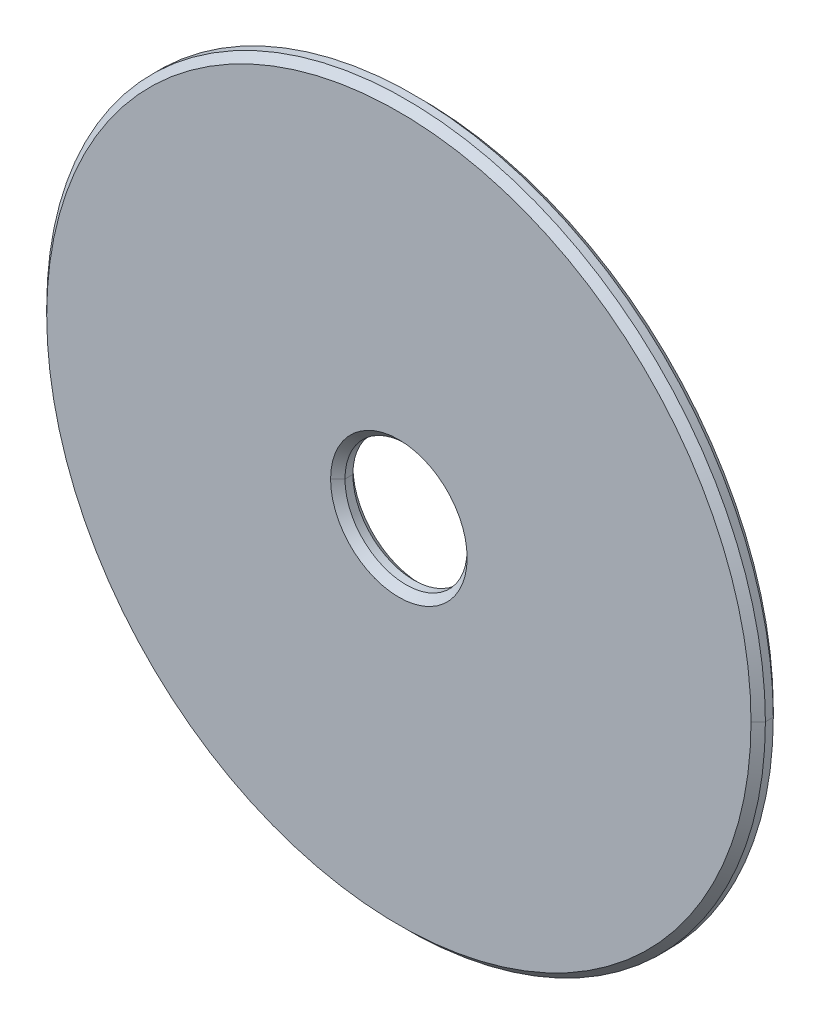
ISO-10303-21;
HEADER;
FILE_DESCRIPTION(('STEP AP214'),'2;1');
FILE_NAME('part.step','',(''),(''),'','','');
FILE_SCHEMA(('AUTOMOTIVE_DESIGN { 1 0 10303 214 1 1 1 1 }'));
ENDSEC;
DATA;
#1=APPLICATION_CONTEXT('core data for automotive mechanical design processes');
#2=APPLICATION_PROTOCOL_DEFINITION('international standard','automotive_design',2000,#1);
#3=PRODUCT_CONTEXT('',#1,'mechanical');
#4=PRODUCT('Part','Part','',(#3));
#5=PRODUCT_RELATED_PRODUCT_CATEGORY('part','',(#4));
#6=PRODUCT_DEFINITION_FORMATION('','',#4);
#7=PRODUCT_DEFINITION_CONTEXT('part definition',#1,'design');
#8=PRODUCT_DEFINITION('design','',#6,#7);
#9=PRODUCT_DEFINITION_SHAPE('','',#8);
#10=(LENGTH_UNIT() NAMED_UNIT(*) SI_UNIT(.MILLI.,.METRE.));
#11=(NAMED_UNIT(*) PLANE_ANGLE_UNIT() SI_UNIT($,.RADIAN.));
#12=(NAMED_UNIT(*) SI_UNIT($,.STERADIAN.) SOLID_ANGLE_UNIT());
#13=UNCERTAINTY_MEASURE_WITH_UNIT(LENGTH_MEASURE(1.E-05),#10,'distance_accuracy_value','');
#14=(GEOMETRIC_REPRESENTATION_CONTEXT(3) GLOBAL_UNCERTAINTY_ASSIGNED_CONTEXT((#13)) GLOBAL_UNIT_ASSIGNED_CONTEXT((#10,
#11,#12)) REPRESENTATION_CONTEXT('',''));
#15=CARTESIAN_POINT('',(0.,0.,0.));
#16=DIRECTION('',(0.,0.,1.));
#17=DIRECTION('',(1.,0.,0.));
#18=AXIS2_PLACEMENT_3D('',#15,#16,#17);
#19=CARTESIAN_POINT('',(0.,0.,0.284487321940548));
#20=DIRECTION('',(0.,0.,-1.));
#21=DIRECTION('',(-1.,0.,0.));
#22=AXIS2_PLACEMENT_3D('',#19,#20,#21);
#23=CONICAL_SURFACE('',#22,2.12851267805944,0.785398163397455);
#24=CARTESIAN_POINT('',(0.,0.,0.253999999999991));
#25=DIRECTION('',(0.,0.,1.));
#26=DIRECTION('',(1.,0.,0.));
#27=AXIS2_PLACEMENT_3D('',#24,#25,#26);
#28=CIRCLE('',#27,2.159);
#29=CARTESIAN_POINT('',(2.159,0.,0.253999999999993));
#30=VERTEX_POINT('',#29);
#31=CARTESIAN_POINT('',(-2.159,0.,0.253999999999993));
#32=VERTEX_POINT('',#31);
#33=EDGE_CURVE('E20',#30,#32,#28,.T.);
#34=ORIENTED_EDGE('',*,*,#33,.T.);
#35=DIRECTION('',(0.707106781186552,0.,0.707106781186543));
#36=VECTOR('',#35,1.);
#37=CARTESIAN_POINT('',(-2.413,0.,0.));
#38=LINE('',#37,#36);
#39=CARTESIAN_POINT('',(-2.413,0.,0.));
#40=VERTEX_POINT('',#39);
#41=EDGE_CURVE('E34',#40,#32,#38,.T.);
#42=ORIENTED_EDGE('',*,*,#41,.F.);
#43=CARTESIAN_POINT('',(0.,0.,0.));
#44=DIRECTION('',(0.,0.,1.));
#45=DIRECTION('',(1.,0.,0.));
#46=AXIS2_PLACEMENT_3D('',#43,#44,#45);
#47=CIRCLE('',#46,2.413);
#48=CARTESIAN_POINT('',(2.413,0.,0.));
#49=VERTEX_POINT('',#48);
#50=EDGE_CURVE('E39',#49,#40,#47,.T.);
#51=ORIENTED_EDGE('',*,*,#50,.F.);
#52=DIRECTION('',(-0.707106781186552,0.,0.707106781186543));
#53=VECTOR('',#52,1.);
#54=CARTESIAN_POINT('',(2.413,0.,0.));
#55=LINE('',#54,#53);
#56=EDGE_CURVE('E152',#49,#30,#55,.T.);
#57=ORIENTED_EDGE('',*,*,#56,.T.);
#58=EDGE_LOOP('',(#34,#42,#51,#57));
#59=FACE_BOUND('',#58,.T.);
#60=ADVANCED_FACE('F17',(#59),#23,.F.);
#61=CARTESIAN_POINT('',(0.,0.,0.502912678059445));
#62=DIRECTION('',(0.,0.,1.));
#63=DIRECTION('',(1.,0.,0.));
#64=AXIS2_PLACEMENT_3D('',#61,#62,#63);
#65=CONICAL_SURFACE('',#64,2.12851267805944,0.785398163397456);
#66=DIRECTION('',(0.707106781186553,0.,-0.707106781186542));
#67=VECTOR('',#66,1.);
#68=CARTESIAN_POINT('',(-2.413,0.,0.787399999999998));
#69=LINE('',#68,#67);
#70=CARTESIAN_POINT('',(-2.413,0.,0.787399999999999));
#71=VERTEX_POINT('',#70);
#72=CARTESIAN_POINT('',(-2.159,0.,0.5334));
#73=VERTEX_POINT('',#72);
#74=EDGE_CURVE('E26',#71,#73,#69,.T.);
#75=ORIENTED_EDGE('',*,*,#74,.F.);
#76=CARTESIAN_POINT('',(0.,0.,0.787399999999997));
#77=DIRECTION('',(0.,0.,-1.));
#78=DIRECTION('',(1.,0.,0.));
#79=AXIS2_PLACEMENT_3D('',#76,#77,#78);
#80=CIRCLE('',#79,2.413);
#81=CARTESIAN_POINT('',(2.413,0.,0.787399999999999));
#82=VERTEX_POINT('',#81);
#83=EDGE_CURVE('E81',#82,#71,#80,.T.);
#84=ORIENTED_EDGE('',*,*,#83,.F.);
#85=DIRECTION('',(-0.707106781186553,0.,-0.707106781186542));
#86=VECTOR('',#85,1.);
#87=CARTESIAN_POINT('',(2.413,0.,0.787399999999998));
#88=LINE('',#87,#86);
#89=CARTESIAN_POINT('',(2.159,0.,0.5334));
#90=VERTEX_POINT('',#89);
#91=EDGE_CURVE('E11',#82,#90,#88,.T.);
#92=ORIENTED_EDGE('',*,*,#91,.T.);
#93=CARTESIAN_POINT('',(0.,0.,0.533400000000003));
#94=DIRECTION('',(0.,0.,-1.));
#95=DIRECTION('',(1.,0.,0.));
#96=AXIS2_PLACEMENT_3D('',#93,#94,#95);
#97=CIRCLE('',#96,2.159);
#98=EDGE_CURVE('E157',#90,#73,#97,.T.);
#99=ORIENTED_EDGE('',*,*,#98,.T.);
#100=EDGE_LOOP('',(#75,#84,#92,#99));
#101=FACE_BOUND('',#100,.T.);
#102=ADVANCED_FACE('F83',(#101),#65,.F.);
#103=CARTESIAN_POINT('',(0.,0.,0.502912678059445));
#104=DIRECTION('',(0.,0.,1.));
#105=DIRECTION('',(1.,0.,0.));
#106=AXIS2_PLACEMENT_3D('',#103,#104,#105);
#107=CONICAL_SURFACE('',#106,2.12851267805944,0.785398163397456);
#108=CARTESIAN_POINT('',(0.,0.,0.533400000000003));
#109=DIRECTION('',(0.,0.,-1.));
#110=DIRECTION('',(-1.,0.,0.));
#111=AXIS2_PLACEMENT_3D('',#108,#109,#110);
#112=CIRCLE('',#111,2.159);
#113=EDGE_CURVE('E96',#73,#90,#112,.T.);
#114=ORIENTED_EDGE('',*,*,#113,.T.);
#115=ORIENTED_EDGE('',*,*,#91,.F.);
#116=CARTESIAN_POINT('',(0.,0.,0.787399999999997));
#117=DIRECTION('',(0.,0.,-1.));
#118=DIRECTION('',(-1.,0.,0.));
#119=AXIS2_PLACEMENT_3D('',#116,#117,#118);
#120=CIRCLE('',#119,2.413);
#121=EDGE_CURVE('E90',#71,#82,#120,.T.);
#122=ORIENTED_EDGE('',*,*,#121,.F.);
#123=ORIENTED_EDGE('',*,*,#74,.T.);
#124=EDGE_LOOP('',(#114,#115,#122,#123));
#125=FACE_BOUND('',#124,.T.);
#126=ADVANCED_FACE('F94',(#125),#107,.F.);
#127=CARTESIAN_POINT('',(0.,0.,3.175));
#128=DIRECTION('',(0.,0.,1.));
#129=DIRECTION('',(1.,0.,0.));
#130=AXIS2_PLACEMENT_3D('',#127,#128,#129);
#131=CYLINDRICAL_SURFACE('',#130,2.159);
#132=ORIENTED_EDGE('',*,*,#33,.F.);
#133=DIRECTION('',(0.,0.,-1.));
#134=VECTOR('',#133,1.);
#135=CARTESIAN_POINT('',(2.159,0.,0.533399999999999));
#136=LINE('',#135,#134);
#137=EDGE_CURVE('E153',#90,#30,#136,.T.);
#138=ORIENTED_EDGE('',*,*,#137,.F.);
#139=ORIENTED_EDGE('',*,*,#113,.F.);
#140=DIRECTION('',(0.,0.,-1.));
#141=VECTOR('',#140,1.);
#142=CARTESIAN_POINT('',(-2.159,0.,0.533399999999999));
#143=LINE('',#142,#141);
#144=EDGE_CURVE('E158',#73,#32,#143,.T.);
#145=ORIENTED_EDGE('',*,*,#144,.T.);
#146=EDGE_LOOP('',(#132,#138,#139,#145));
#147=FACE_BOUND('',#146,.T.);
#148=ADVANCED_FACE('F172',(#147),#131,.F.);
#149=CARTESIAN_POINT('',(0.,0.,3.175));
#150=DIRECTION('',(0.,0.,1.));
#151=DIRECTION('',(1.,0.,0.));
#152=AXIS2_PLACEMENT_3D('',#149,#150,#151);
#153=CYLINDRICAL_SURFACE('',#152,2.159);
#154=ORIENTED_EDGE('',*,*,#144,.F.);
#155=ORIENTED_EDGE('',*,*,#98,.F.);
#156=ORIENTED_EDGE('',*,*,#137,.T.);
#157=CARTESIAN_POINT('',(0.,0.,0.253999999999991));
#158=DIRECTION('',(0.,0.,1.));
#159=DIRECTION('',(-1.,0.,0.));
#160=AXIS2_PLACEMENT_3D('',#157,#158,#159);
#161=CIRCLE('',#160,2.159);
#162=EDGE_CURVE('E146',#32,#30,#161,.T.);
#163=ORIENTED_EDGE('',*,*,#162,.F.);
#164=EDGE_LOOP('',(#154,#155,#156,#163));
#165=FACE_BOUND('',#164,.T.);
#166=ADVANCED_FACE('F178',(#165),#153,.F.);
#167=CARTESIAN_POINT('',(0.,0.,0.284487321940548));
#168=DIRECTION('',(0.,0.,-1.));
#169=DIRECTION('',(-1.,0.,0.));
#170=AXIS2_PLACEMENT_3D('',#167,#168,#169);
#171=CONICAL_SURFACE('',#170,2.12851267805944,0.785398163397455);
#172=ORIENTED_EDGE('',*,*,#56,.F.);
#173=CARTESIAN_POINT('',(0.,0.,0.));
#174=DIRECTION('',(0.,0.,1.));
#175=DIRECTION('',(-1.,0.,0.));
#176=AXIS2_PLACEMENT_3D('',#173,#174,#175);
#177=CIRCLE('',#176,2.413);
#178=EDGE_CURVE('E140',#40,#49,#177,.T.);
#179=ORIENTED_EDGE('',*,*,#178,.F.);
#180=ORIENTED_EDGE('',*,*,#41,.T.);
#181=ORIENTED_EDGE('',*,*,#162,.T.);
#182=EDGE_LOOP('',(#172,#179,#180,#181));
#183=FACE_BOUND('',#182,.T.);
#184=ADVANCED_FACE('F179',(#183),#171,.F.);
#185=CARTESIAN_POINT('',(0.,0.,0.));
#186=DIRECTION('',(0.,0.,1.));
#187=DIRECTION('',(1.,0.,0.));
#188=AXIS2_PLACEMENT_3D('',#185,#186,#187);
#189=PLANE('',#188);
#190=ORIENTED_EDGE('',*,*,#50,.T.);
#191=ORIENTED_EDGE('',*,*,#178,.T.);
#192=EDGE_LOOP('',(#190,#191));
#193=FACE_BOUND('',#192,.T.);
#194=CARTESIAN_POINT('',(0.,0.,0.));
#195=DIRECTION('',(0.,0.,-1.));
#196=DIRECTION('',(-1.,0.,0.));
#197=AXIS2_PLACEMENT_3D('',#194,#195,#196);
#198=CIRCLE('',#197,12.446);
#199=CARTESIAN_POINT('',(-12.446,0.,0.));
#200=VERTEX_POINT('',#199);
#201=CARTESIAN_POINT('',(12.446,0.,0.));
#202=VERTEX_POINT('',#201);
#203=EDGE_CURVE('E137',#200,#202,#198,.T.);
#204=ORIENTED_EDGE('',*,*,#203,.T.);
#205=CARTESIAN_POINT('',(0.,0.,0.));
#206=DIRECTION('',(0.,0.,-1.));
#207=DIRECTION('',(1.,0.,0.));
#208=AXIS2_PLACEMENT_3D('',#205,#206,#207);
#209=CIRCLE('',#208,12.446);
#210=EDGE_CURVE('E131',#202,#200,#209,.T.);
#211=ORIENTED_EDGE('',*,*,#210,.T.);
#212=EDGE_LOOP('',(#204,#211));
#213=FACE_BOUND('',#212,.T.);
#214=ADVANCED_FACE('F181',(#193,#213),#189,.F.);
#215=CARTESIAN_POINT('',(0.,0.,-0.0304873219405723));
#216=DIRECTION('',(0.,0.,1.));
#217=DIRECTION('',(1.,0.,0.));
#218=AXIS2_PLACEMENT_3D('',#215,#216,#217);
#219=CONICAL_SURFACE('',#218,12.4155126780594,0.785398163397452);
#220=DIRECTION('',(0.70710678118655,0.,-0.707106781186545));
#221=VECTOR('',#220,1.);
#222=CARTESIAN_POINT('',(-12.7,0.,0.253999999999996));
#223=LINE('',#222,#221);
#224=CARTESIAN_POINT('',(-12.7,0.,0.253999999999996));
#225=VERTEX_POINT('',#224);
#226=EDGE_CURVE('E120',#225,#200,#223,.T.);
#227=ORIENTED_EDGE('',*,*,#226,.F.);
#228=CARTESIAN_POINT('',(0.,0.,0.253999999999999));
#229=DIRECTION('',(0.,0.,-1.));
#230=DIRECTION('',(-1.,0.,0.));
#231=AXIS2_PLACEMENT_3D('',#228,#229,#230);
#232=CIRCLE('',#231,12.7);
#233=CARTESIAN_POINT('',(12.7,0.,0.253999999999996));
#234=VERTEX_POINT('',#233);
#235=EDGE_CURVE('E119',#225,#234,#232,.T.);
#236=ORIENTED_EDGE('',*,*,#235,.T.);
#237=DIRECTION('',(-0.70710678118655,0.,-0.707106781186545));
#238=VECTOR('',#237,1.);
#239=CARTESIAN_POINT('',(12.7,0.,0.253999999999996));
#240=LINE('',#239,#238);
#241=EDGE_CURVE('E124',#234,#202,#240,.T.);
#242=ORIENTED_EDGE('',*,*,#241,.T.);
#243=ORIENTED_EDGE('',*,*,#203,.F.);
#244=EDGE_LOOP('',(#227,#236,#242,#243));
#245=FACE_BOUND('',#244,.T.);
#246=ADVANCED_FACE('F184',(#245),#219,.T.);
#247=CARTESIAN_POINT('',(0.,0.,-0.0304873219405723));
#248=DIRECTION('',(0.,0.,1.));
#249=DIRECTION('',(1.,0.,0.));
#250=AXIS2_PLACEMENT_3D('',#247,#248,#249);
#251=CONICAL_SURFACE('',#250,12.4155126780594,0.785398163397452);
#252=ORIENTED_EDGE('',*,*,#210,.F.);
#253=ORIENTED_EDGE('',*,*,#241,.F.);
#254=CARTESIAN_POINT('',(0.,0.,0.253999999999999));
#255=DIRECTION('',(0.,0.,-1.));
#256=DIRECTION('',(1.,0.,0.));
#257=AXIS2_PLACEMENT_3D('',#254,#255,#256);
#258=CIRCLE('',#257,12.7);
#259=EDGE_CURVE('E107',#234,#225,#258,.T.);
#260=ORIENTED_EDGE('',*,*,#259,.T.);
#261=ORIENTED_EDGE('',*,*,#226,.T.);
#262=EDGE_LOOP('',(#252,#253,#260,#261));
#263=FACE_BOUND('',#262,.T.);
#264=ADVANCED_FACE('F193',(#263),#251,.T.);
#265=CARTESIAN_POINT('',(0.,0.,3.175));
#266=DIRECTION('',(0.,0.,-1.));
#267=DIRECTION('',(-1.,0.,0.));
#268=AXIS2_PLACEMENT_3D('',#265,#266,#267);
#269=CYLINDRICAL_SURFACE('',#268,12.7);
#270=CARTESIAN_POINT('',(0.,0.,0.533399999999998));
#271=DIRECTION('',(0.,0.,1.));
#272=DIRECTION('',(-1.,0.,0.));
#273=AXIS2_PLACEMENT_3D('',#270,#271,#272);
#274=CIRCLE('',#273,12.7);
#275=CARTESIAN_POINT('',(-12.7,0.,0.533400000000005));
#276=VERTEX_POINT('',#275);
#277=CARTESIAN_POINT('',(12.7,0.,0.533400000000005));
#278=VERTEX_POINT('',#277);
#279=EDGE_CURVE('E101',#276,#278,#274,.T.);
#280=ORIENTED_EDGE('',*,*,#279,.F.);
#281=DIRECTION('',(0.,0.,1.));
#282=VECTOR('',#281,1.);
#283=CARTESIAN_POINT('',(-12.7,0.,0.253999999999996));
#284=LINE('',#283,#282);
#285=EDGE_CURVE('E134',#225,#276,#284,.T.);
#286=ORIENTED_EDGE('',*,*,#285,.F.);
#287=ORIENTED_EDGE('',*,*,#259,.F.);
#288=DIRECTION('',(0.,0.,1.));
#289=VECTOR('',#288,1.);
#290=CARTESIAN_POINT('',(12.7,0.,0.253999999999996));
#291=LINE('',#290,#289);
#292=EDGE_CURVE('E115',#234,#278,#291,.T.);
#293=ORIENTED_EDGE('',*,*,#292,.T.);
#294=EDGE_LOOP('',(#280,#286,#287,#293));
#295=FACE_BOUND('',#294,.T.);
#296=ADVANCED_FACE('F198',(#295),#269,.T.);
#297=CARTESIAN_POINT('',(0.,0.,0.817887321940566));
#298=DIRECTION('',(0.,0.,-1.));
#299=DIRECTION('',(-1.,0.,0.));
#300=AXIS2_PLACEMENT_3D('',#297,#298,#299);
#301=CONICAL_SURFACE('',#300,12.4155126780594,0.785398163397438);
#302=CARTESIAN_POINT('',(0.,0.,0.787400000000008));
#303=DIRECTION('',(0.,0.,1.));
#304=DIRECTION('',(-1.,0.,0.));
#305=AXIS2_PLACEMENT_3D('',#302,#303,#304);
#306=CIRCLE('',#305,12.446);
#307=CARTESIAN_POINT('',(-12.446,0.,0.787400000000005));
#308=VERTEX_POINT('',#307);
#309=CARTESIAN_POINT('',(12.446,0.,0.787400000000005));
#310=VERTEX_POINT('',#309);
#311=EDGE_CURVE('E91',#308,#310,#306,.T.);
#312=ORIENTED_EDGE('',*,*,#311,.F.);
#313=DIRECTION('',(0.70710678118654,0.,0.707106781186555));
#314=VECTOR('',#313,1.);
#315=CARTESIAN_POINT('',(-12.7,0.,0.533399999999998));
#316=LINE('',#315,#314);
#317=EDGE_CURVE('E113',#276,#308,#316,.T.);
#318=ORIENTED_EDGE('',*,*,#317,.F.);
#319=ORIENTED_EDGE('',*,*,#279,.T.);
#320=DIRECTION('',(-0.70710678118654,0.,0.707106781186555));
#321=VECTOR('',#320,1.);
#322=CARTESIAN_POINT('',(12.7,0.,0.533399999999998));
#323=LINE('',#322,#321);
#324=EDGE_CURVE('E111',#278,#310,#323,.T.);
#325=ORIENTED_EDGE('',*,*,#324,.T.);
#326=EDGE_LOOP('',(#312,#318,#319,#325));
#327=FACE_BOUND('',#326,.T.);
#328=ADVANCED_FACE('F209',(#327),#301,.T.);
#329=CARTESIAN_POINT('',(0.,0.,0.7874));
#330=DIRECTION('',(0.,0.,1.));
#331=DIRECTION('',(1.,0.,0.));
#332=AXIS2_PLACEMENT_3D('',#329,#330,#331);
#333=PLANE('',#332);
#334=ORIENTED_EDGE('',*,*,#121,.T.);
#335=ORIENTED_EDGE('',*,*,#83,.T.);
#336=EDGE_LOOP('',(#334,#335));
#337=FACE_BOUND('',#336,.T.);
#338=CARTESIAN_POINT('',(0.,0.,0.787400000000008));
#339=DIRECTION('',(0.,0.,1.));
#340=DIRECTION('',(1.,0.,0.));
#341=AXIS2_PLACEMENT_3D('',#338,#339,#340);
#342=CIRCLE('',#341,12.446);
#343=EDGE_CURVE('E118',#310,#308,#342,.T.);
#344=ORIENTED_EDGE('',*,*,#343,.T.);
#345=ORIENTED_EDGE('',*,*,#311,.T.);
#346=EDGE_LOOP('',(#344,#345));
#347=FACE_BOUND('',#346,.T.);
#348=ADVANCED_FACE('F98',(#337,#347),#333,.T.);
#349=CARTESIAN_POINT('',(0.,0.,0.817887321940566));
#350=DIRECTION('',(0.,0.,-1.));
#351=DIRECTION('',(-1.,0.,0.));
#352=AXIS2_PLACEMENT_3D('',#349,#350,#351);
#353=CONICAL_SURFACE('',#352,12.4155126780594,0.785398163397438);
#354=ORIENTED_EDGE('',*,*,#324,.F.);
#355=CARTESIAN_POINT('',(0.,0.,0.533399999999998));
#356=DIRECTION('',(0.,0.,1.));
#357=DIRECTION('',(1.,0.,0.));
#358=AXIS2_PLACEMENT_3D('',#355,#356,#357);
#359=CIRCLE('',#358,12.7);
#360=EDGE_CURVE('E203',#278,#276,#359,.T.);
#361=ORIENTED_EDGE('',*,*,#360,.T.);
#362=ORIENTED_EDGE('',*,*,#317,.T.);
#363=ORIENTED_EDGE('',*,*,#343,.F.);
#364=EDGE_LOOP('',(#354,#361,#362,#363));
#365=FACE_BOUND('',#364,.T.);
#366=ADVANCED_FACE('F214',(#365),#353,.T.);
#367=CARTESIAN_POINT('',(0.,0.,3.175));
#368=DIRECTION('',(0.,0.,-1.));
#369=DIRECTION('',(-1.,0.,0.));
#370=AXIS2_PLACEMENT_3D('',#367,#368,#369);
#371=CYLINDRICAL_SURFACE('',#370,12.7);
#372=ORIENTED_EDGE('',*,*,#292,.F.);
#373=ORIENTED_EDGE('',*,*,#235,.F.);
#374=ORIENTED_EDGE('',*,*,#285,.T.);
#375=ORIENTED_EDGE('',*,*,#360,.F.);
#376=EDGE_LOOP('',(#372,#373,#374,#375));
#377=FACE_BOUND('',#376,.T.);
#378=ADVANCED_FACE('F205',(#377),#371,.T.);
#379=CLOSED_SHELL('',(#60,#102,#126,#148,#166,#184,#214,#246,#264,#296,#328,#348,#366,#378));
#380=MANIFOLD_SOLID_BREP('B1',#379);
#381=ADVANCED_BREP_SHAPE_REPRESENTATION('',(#18,#380),#14);
#382=SHAPE_DEFINITION_REPRESENTATION(#9,#381);
ENDSEC;
END-ISO-10303-21;
